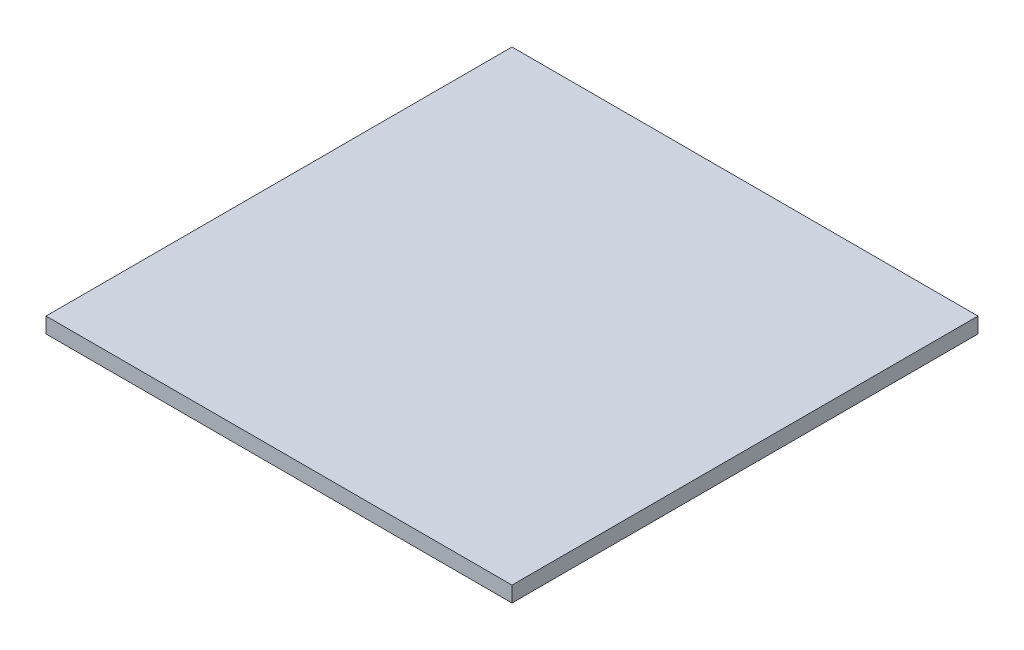
ISO-10303-21;
HEADER;
FILE_DESCRIPTION(('STEP AP214'),'2;1');
FILE_NAME('part.step','',(''),(''),'','','');
FILE_SCHEMA(('AUTOMOTIVE_DESIGN { 1 0 10303 214 1 1 1 1 }'));
ENDSEC;
DATA;
#1=APPLICATION_CONTEXT('core data for automotive mechanical design processes');
#2=APPLICATION_PROTOCOL_DEFINITION('international standard','automotive_design',2000,#1);
#3=PRODUCT_CONTEXT('',#1,'mechanical');
#4=PRODUCT('Part','Part','',(#3));
#5=PRODUCT_RELATED_PRODUCT_CATEGORY('part','',(#4));
#6=PRODUCT_DEFINITION_FORMATION('','',#4);
#7=PRODUCT_DEFINITION_CONTEXT('part definition',#1,'design');
#8=PRODUCT_DEFINITION('design','',#6,#7);
#9=PRODUCT_DEFINITION_SHAPE('','',#8);
#10=(LENGTH_UNIT() NAMED_UNIT(*) SI_UNIT(.MILLI.,.METRE.));
#11=(NAMED_UNIT(*) PLANE_ANGLE_UNIT() SI_UNIT($,.RADIAN.));
#12=(NAMED_UNIT(*) SI_UNIT($,.STERADIAN.) SOLID_ANGLE_UNIT());
#13=UNCERTAINTY_MEASURE_WITH_UNIT(LENGTH_MEASURE(1.E-05),#10,'distance_accuracy_value','');
#14=(GEOMETRIC_REPRESENTATION_CONTEXT(3) GLOBAL_UNCERTAINTY_ASSIGNED_CONTEXT((#13)) GLOBAL_UNIT_ASSIGNED_CONTEXT((#10,
#11,#12)) REPRESENTATION_CONTEXT('',''));
#15=CARTESIAN_POINT('',(0.,0.,0.));
#16=DIRECTION('',(0.,0.,1.));
#17=DIRECTION('',(1.,0.,0.));
#18=AXIS2_PLACEMENT_3D('',#15,#16,#17);
#19=CARTESIAN_POINT('',(30.,2.,30.));
#20=DIRECTION('',(-1.,0.,0.));
#21=DIRECTION('',(0.,0.,1.));
#22=AXIS2_PLACEMENT_3D('',#19,#20,#21);
#23=PLANE('',#22);
#24=DIRECTION('',(0.,0.,-1.));
#25=VECTOR('',#24,1.);
#26=CARTESIAN_POINT('',(30.,0.,30.));
#27=LINE('',#26,#25);
#28=CARTESIAN_POINT('',(30.,0.,30.));
#29=VERTEX_POINT('',#28);
#30=CARTESIAN_POINT('',(30.,0.,-30.));
#31=VERTEX_POINT('',#30);
#32=EDGE_CURVE('E95',#29,#31,#27,.T.);
#33=ORIENTED_EDGE('',*,*,#32,.T.);
#34=DIRECTION('',(0.,-1.,0.));
#35=VECTOR('',#34,1.);
#36=CARTESIAN_POINT('',(30.,2.,-30.));
#37=LINE('',#36,#35);
#38=CARTESIAN_POINT('',(30.,2.,-30.));
#39=VERTEX_POINT('',#38);
#40=EDGE_CURVE('E11',#39,#31,#37,.T.);
#41=ORIENTED_EDGE('',*,*,#40,.F.);
#42=DIRECTION('',(0.,0.,-1.));
#43=VECTOR('',#42,1.);
#44=CARTESIAN_POINT('',(30.,2.,30.));
#45=LINE('',#44,#43);
#46=CARTESIAN_POINT('',(30.,2.,30.));
#47=VERTEX_POINT('',#46);
#48=EDGE_CURVE('E83',#47,#39,#45,.T.);
#49=ORIENTED_EDGE('',*,*,#48,.F.);
#50=DIRECTION('',(0.,-1.,0.));
#51=VECTOR('',#50,1.);
#52=CARTESIAN_POINT('',(30.,2.,30.));
#53=LINE('',#52,#51);
#54=EDGE_CURVE('E91',#47,#29,#53,.T.);
#55=ORIENTED_EDGE('',*,*,#54,.T.);
#56=EDGE_LOOP('',(#33,#41,#49,#55));
#57=FACE_BOUND('',#56,.T.);
#58=ADVANCED_FACE('F32',(#57),#23,.F.);
#59=CARTESIAN_POINT('',(-30.,2.,-30.));
#60=DIRECTION('',(0.,0.,1.));
#61=DIRECTION('',(1.,0.,0.));
#62=AXIS2_PLACEMENT_3D('',#59,#60,#61);
#63=PLANE('',#62);
#64=DIRECTION('',(-1.,0.,0.));
#65=VECTOR('',#64,1.);
#66=CARTESIAN_POINT('',(-30.,0.,-30.));
#67=LINE('',#66,#65);
#68=CARTESIAN_POINT('',(-30.,0.,-30.));
#69=VERTEX_POINT('',#68);
#70=EDGE_CURVE('E87',#31,#69,#67,.T.);
#71=ORIENTED_EDGE('',*,*,#70,.T.);
#72=DIRECTION('',(0.,-1.,0.));
#73=VECTOR('',#72,1.);
#74=CARTESIAN_POINT('',(-30.,2.,-30.));
#75=LINE('',#74,#73);
#76=CARTESIAN_POINT('',(-30.,2.,-30.));
#77=VERTEX_POINT('',#76);
#78=EDGE_CURVE('E40',#77,#69,#75,.T.);
#79=ORIENTED_EDGE('',*,*,#78,.F.);
#80=DIRECTION('',(-1.,0.,0.));
#81=VECTOR('',#80,1.);
#82=CARTESIAN_POINT('',(-30.,2.,-30.));
#83=LINE('',#82,#81);
#84=EDGE_CURVE('E78',#39,#77,#83,.T.);
#85=ORIENTED_EDGE('',*,*,#84,.F.);
#86=ORIENTED_EDGE('',*,*,#40,.T.);
#87=EDGE_LOOP('',(#71,#79,#85,#86));
#88=FACE_BOUND('',#87,.T.);
#89=ADVANCED_FACE('F86',(#88),#63,.F.);
#90=CARTESIAN_POINT('',(-30.,2.,30.));
#91=DIRECTION('',(1.,0.,0.));
#92=DIRECTION('',(0.,0.,-1.));
#93=AXIS2_PLACEMENT_3D('',#90,#91,#92);
#94=PLANE('',#93);
#95=DIRECTION('',(0.,0.,1.));
#96=VECTOR('',#95,1.);
#97=CARTESIAN_POINT('',(-30.,0.,30.));
#98=LINE('',#97,#96);
#99=CARTESIAN_POINT('',(-30.,0.,30.));
#100=VERTEX_POINT('',#99);
#101=EDGE_CURVE('E65',#69,#100,#98,.T.);
#102=ORIENTED_EDGE('',*,*,#101,.T.);
#103=DIRECTION('',(0.,-1.,0.));
#104=VECTOR('',#103,1.);
#105=CARTESIAN_POINT('',(-30.,2.,30.));
#106=LINE('',#105,#104);
#107=CARTESIAN_POINT('',(-30.,2.,30.));
#108=VERTEX_POINT('',#107);
#109=EDGE_CURVE('E88',#108,#100,#106,.T.);
#110=ORIENTED_EDGE('',*,*,#109,.F.);
#111=DIRECTION('',(0.,0.,1.));
#112=VECTOR('',#111,1.);
#113=CARTESIAN_POINT('',(-30.,2.,30.));
#114=LINE('',#113,#112);
#115=EDGE_CURVE('E81',#77,#108,#114,.T.);
#116=ORIENTED_EDGE('',*,*,#115,.F.);
#117=ORIENTED_EDGE('',*,*,#78,.T.);
#118=EDGE_LOOP('',(#102,#110,#116,#117));
#119=FACE_BOUND('',#118,.T.);
#120=ADVANCED_FACE('F89',(#119),#94,.F.);
#121=CARTESIAN_POINT('',(-30.,2.,30.));
#122=DIRECTION('',(0.,0.,-1.));
#123=DIRECTION('',(-1.,0.,0.));
#124=AXIS2_PLACEMENT_3D('',#121,#122,#123);
#125=PLANE('',#124);
#126=DIRECTION('',(1.,0.,0.));
#127=VECTOR('',#126,1.);
#128=CARTESIAN_POINT('',(-30.,0.,30.));
#129=LINE('',#128,#127);
#130=EDGE_CURVE('E71',#100,#29,#129,.T.);
#131=ORIENTED_EDGE('',*,*,#130,.T.);
#132=ORIENTED_EDGE('',*,*,#54,.F.);
#133=DIRECTION('',(1.,0.,0.));
#134=VECTOR('',#133,1.);
#135=CARTESIAN_POINT('',(-30.,2.,30.));
#136=LINE('',#135,#134);
#137=EDGE_CURVE('E48',#108,#47,#136,.T.);
#138=ORIENTED_EDGE('',*,*,#137,.F.);
#139=ORIENTED_EDGE('',*,*,#109,.T.);
#140=EDGE_LOOP('',(#131,#132,#138,#139));
#141=FACE_BOUND('',#140,.T.);
#142=ADVANCED_FACE('F102',(#141),#125,.F.);
#143=CARTESIAN_POINT('',(0.,2.,0.));
#144=DIRECTION('',(0.,-1.,0.));
#145=DIRECTION('',(0.,0.,-1.));
#146=AXIS2_PLACEMENT_3D('',#143,#144,#145);
#147=PLANE('',#146);
#148=ORIENTED_EDGE('',*,*,#48,.T.);
#149=ORIENTED_EDGE('',*,*,#84,.T.);
#150=ORIENTED_EDGE('',*,*,#115,.T.);
#151=ORIENTED_EDGE('',*,*,#137,.T.);
#152=EDGE_LOOP('',(#148,#149,#150,#151));
#153=FACE_BOUND('',#152,.T.);
#154=ADVANCED_FACE('F79',(#153),#147,.F.);
#155=CARTESIAN_POINT('',(0.,0.,0.));
#156=DIRECTION('',(0.,-1.,0.));
#157=DIRECTION('',(0.,0.,-1.));
#158=AXIS2_PLACEMENT_3D('',#155,#156,#157);
#159=PLANE('',#158);
#160=ORIENTED_EDGE('',*,*,#32,.F.);
#161=ORIENTED_EDGE('',*,*,#130,.F.);
#162=ORIENTED_EDGE('',*,*,#101,.F.);
#163=ORIENTED_EDGE('',*,*,#70,.F.);
#164=EDGE_LOOP('',(#160,#161,#162,#163));
#165=FACE_BOUND('',#164,.T.);
#166=ADVANCED_FACE('F105',(#165),#159,.T.);
#167=CLOSED_SHELL('',(#58,#89,#120,#142,#154,#166));
#168=MANIFOLD_SOLID_BREP('B2',#167);
#169=ADVANCED_BREP_SHAPE_REPRESENTATION('',(#18,#168),#14);
#170=SHAPE_DEFINITION_REPRESENTATION(#9,#169);
ENDSEC;
END-ISO-10303-21;
